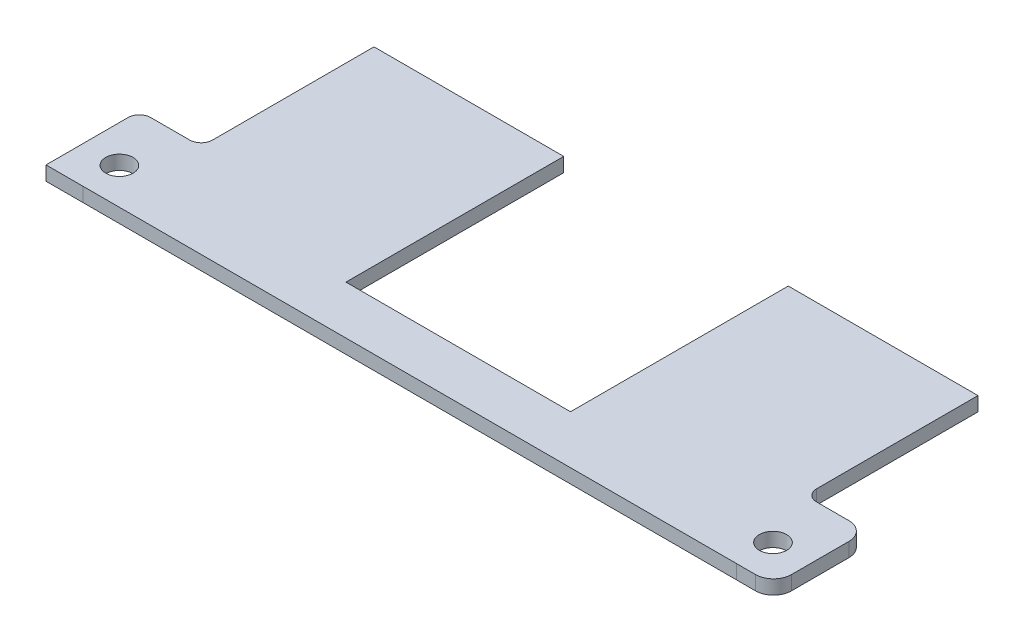
ISO-10303-21;
HEADER;
FILE_DESCRIPTION(('STEP AP214'),'2;1');
FILE_NAME('part.step','',(''),(''),'','','');
FILE_SCHEMA(('AUTOMOTIVE_DESIGN { 1 0 10303 214 1 1 1 1 }'));
ENDSEC;
DATA;
#1=APPLICATION_CONTEXT('core data for automotive mechanical design processes');
#2=APPLICATION_PROTOCOL_DEFINITION('international standard','automotive_design',2000,#1);
#3=PRODUCT_CONTEXT('',#1,'mechanical');
#4=PRODUCT('Part','Part','',(#3));
#5=PRODUCT_RELATED_PRODUCT_CATEGORY('part','',(#4));
#6=PRODUCT_DEFINITION_FORMATION('','',#4);
#7=PRODUCT_DEFINITION_CONTEXT('part definition',#1,'design');
#8=PRODUCT_DEFINITION('design','',#6,#7);
#9=PRODUCT_DEFINITION_SHAPE('','',#8);
#10=(LENGTH_UNIT() NAMED_UNIT(*) SI_UNIT(.MILLI.,.METRE.));
#11=(NAMED_UNIT(*) PLANE_ANGLE_UNIT() SI_UNIT($,.RADIAN.));
#12=(NAMED_UNIT(*) SI_UNIT($,.STERADIAN.) SOLID_ANGLE_UNIT());
#13=UNCERTAINTY_MEASURE_WITH_UNIT(LENGTH_MEASURE(1.E-05),#10,'distance_accuracy_value','');
#14=(GEOMETRIC_REPRESENTATION_CONTEXT(3) GLOBAL_UNCERTAINTY_ASSIGNED_CONTEXT((#13)) GLOBAL_UNIT_ASSIGNED_CONTEXT((#10,
#11,#12)) REPRESENTATION_CONTEXT('',''));
#15=CARTESIAN_POINT('',(0.,0.,0.));
#16=DIRECTION('',(0.,0.,1.));
#17=DIRECTION('',(1.,0.,0.));
#18=AXIS2_PLACEMENT_3D('',#15,#16,#17);
#19=CARTESIAN_POINT('',(38.8512933051951,1.575,38.0144122461493));
#20=DIRECTION('',(0.,1.,0.));
#21=DIRECTION('',(0.,0.,1.));
#22=AXIS2_PLACEMENT_3D('',#19,#20,#21);
#23=PLANE('',#22);
#24=CARTESIAN_POINT('',(36.7272933151951,1.575,35.947946891947));
#25=DIRECTION('',(0.,1.,0.));
#26=DIRECTION('',(0.,0.,1.));
#27=AXIS2_PLACEMENT_3D('',#24,#25,#26);
#28=CIRCLE('',#27,1.52399999234956);
#29=CARTESIAN_POINT('',(36.7272933151951,1.575,37.4719468842965));
#30=VERTEX_POINT('',#29);
#31=EDGE_CURVE('E211',#30,#30,#28,.T.);
#32=ORIENTED_EDGE('',*,*,#31,.F.);
#33=EDGE_LOOP('',(#32));
#34=FACE_BOUND('',#33,.T.);
#35=DIRECTION('',(1.,0.,0.));
#36=VECTOR('',#35,1.);
#37=CARTESIAN_POINT('',(-29.6747066928049,1.575,40.0124122461493));
#38=LINE('',#37,#36);
#39=CARTESIAN_POINT('',(-36.0247067008049,1.575,40.0124122461493));
#40=VERTEX_POINT('',#39);
#41=CARTESIAN_POINT('',(36.7272933151951,1.575,40.0124122461493));
#42=VERTEX_POINT('',#41);
#43=EDGE_CURVE('E50',#40,#42,#38,.T.);
#44=ORIENTED_EDGE('',*,*,#43,.T.);
#45=DIRECTION('',(0.,0.,1.));
#46=VECTOR('',#45,1.);
#47=CARTESIAN_POINT('',(36.7272933151951,1.575,40.0144122461493));
#48=LINE('',#47,#46);
#49=CARTESIAN_POINT('',(36.7272933151951,1.575,40.0144122461493));
#50=VERTEX_POINT('',#49);
#51=EDGE_CURVE('E364',#42,#50,#48,.T.);
#52=ORIENTED_EDGE('',*,*,#51,.T.);
#53=DIRECTION('',(1.,0.,0.));
#54=VECTOR('',#53,1.);
#55=CARTESIAN_POINT('',(38.8512933051951,1.575,40.0144122461493));
#56=LINE('',#55,#54);
#57=CARTESIAN_POINT('',(38.8512933051951,1.575,40.0144122461493));
#58=VERTEX_POINT('',#57);
#59=EDGE_CURVE('E304',#50,#58,#56,.T.);
#60=ORIENTED_EDGE('',*,*,#59,.T.);
#61=CARTESIAN_POINT('',(38.8512933051951,1.575,38.0144122461493));
#62=DIRECTION('',(0.,1.,0.));
#63=DIRECTION('',(0.,0.,1.));
#64=AXIS2_PLACEMENT_3D('',#61,#62,#63);
#65=CIRCLE('',#64,2.);
#66=CARTESIAN_POINT('',(40.8512933051951,1.575,38.0144122461492));
#67=VERTEX_POINT('',#66);
#68=EDGE_CURVE('E326',#58,#67,#65,.T.);
#69=ORIENTED_EDGE('',*,*,#68,.T.);
#70=DIRECTION('',(0.,0.,-1.));
#71=VECTOR('',#70,1.);
#72=CARTESIAN_POINT('',(40.8512933051951,1.575,38.0144122461492));
#73=LINE('',#72,#71);
#74=CARTESIAN_POINT('',(40.8512933051951,1.575,31.615946891947));
#75=VERTEX_POINT('',#74);
#76=EDGE_CURVE('E323',#67,#75,#73,.T.);
#77=ORIENTED_EDGE('',*,*,#76,.T.);
#78=CARTESIAN_POINT('',(38.8512933051951,1.575,31.615946891947));
#79=DIRECTION('',(0.,1.,0.));
#80=DIRECTION('',(0.,0.,1.));
#81=AXIS2_PLACEMENT_3D('',#78,#79,#80);
#82=CIRCLE('',#81,2.);
#83=CARTESIAN_POINT('',(38.8512933051951,1.575,29.615946891947));
#84=VERTEX_POINT('',#83);
#85=EDGE_CURVE('E325',#75,#84,#82,.T.);
#86=ORIENTED_EDGE('',*,*,#85,.T.);
#87=DIRECTION('',(-1.,0.,0.));
#88=VECTOR('',#87,1.);
#89=CARTESIAN_POINT('',(38.8512933051951,1.575,29.615946891947));
#90=LINE('',#89,#88);
#91=CARTESIAN_POINT('',(35.2462933051951,1.575,29.615946891947));
#92=VERTEX_POINT('',#91);
#93=EDGE_CURVE('E328',#84,#92,#90,.T.);
#94=ORIENTED_EDGE('',*,*,#93,.T.);
#95=CARTESIAN_POINT('',(35.2462933051951,1.575,28.345946891947));
#96=DIRECTION('',(0.,-1.,0.));
#97=DIRECTION('',(0.,0.,1.));
#98=AXIS2_PLACEMENT_3D('',#95,#96,#97);
#99=CIRCLE('',#98,1.26999999999999);
#100=CARTESIAN_POINT('',(33.9762933051951,1.575,28.345946891947));
#101=VERTEX_POINT('',#100);
#102=EDGE_CURVE('E334',#92,#101,#99,.T.);
#103=ORIENTED_EDGE('',*,*,#102,.T.);
#104=DIRECTION('',(0.,0.,-1.));
#105=VECTOR('',#104,1.);
#106=CARTESIAN_POINT('',(33.9762933051951,1.575,28.345946891947));
#107=LINE('',#106,#105);
#108=CARTESIAN_POINT('',(33.9762933051951,1.575,10.3704284449379));
#109=VERTEX_POINT('',#108);
#110=EDGE_CURVE('E336',#101,#109,#107,.T.);
#111=ORIENTED_EDGE('',*,*,#110,.T.);
#112=DIRECTION('',(-1.,0.,0.));
#113=VECTOR('',#112,1.);
#114=CARTESIAN_POINT('',(12.8512933091951,1.575,10.3704284449379));
#115=LINE('',#114,#113);
#116=CARTESIAN_POINT('',(12.8512933091951,1.575,10.3704284449379));
#117=VERTEX_POINT('',#116);
#118=EDGE_CURVE('E338',#109,#117,#115,.T.);
#119=ORIENTED_EDGE('',*,*,#118,.T.);
#120=DIRECTION('',(0.,0.,1.));
#121=VECTOR('',#120,1.);
#122=CARTESIAN_POINT('',(12.8512933091951,1.575,10.3704284449379));
#123=LINE('',#122,#121);
#124=CARTESIAN_POINT('',(12.8512933091951,1.575,34.615947015947));
#125=VERTEX_POINT('',#124);
#126=EDGE_CURVE('E340',#117,#125,#123,.T.);
#127=ORIENTED_EDGE('',*,*,#126,.T.);
#128=DIRECTION('',(-1.,0.,0.));
#129=VECTOR('',#128,1.);
#130=CARTESIAN_POINT('',(-12.1487066908049,1.575,34.615947015947));
#131=LINE('',#130,#129);
#132=CARTESIAN_POINT('',(-12.1487066908049,1.575,34.615947015947));
#133=VERTEX_POINT('',#132);
#134=EDGE_CURVE('E342',#125,#133,#131,.T.);
#135=ORIENTED_EDGE('',*,*,#134,.T.);
#136=DIRECTION('',(0.,0.,-1.));
#137=VECTOR('',#136,1.);
#138=CARTESIAN_POINT('',(-12.1487066908049,1.575,17.871301307947));
#139=LINE('',#138,#137);
#140=CARTESIAN_POINT('',(-12.1487066908049,1.575,10.3704284449379));
#141=VERTEX_POINT('',#140);
#142=EDGE_CURVE('E344',#133,#141,#139,.T.);
#143=ORIENTED_EDGE('',*,*,#142,.T.);
#144=DIRECTION('',(-1.,0.,0.));
#145=VECTOR('',#144,1.);
#146=CARTESIAN_POINT('',(-33.2737066908049,1.575,10.3704284449379));
#147=LINE('',#146,#145);
#148=CARTESIAN_POINT('',(-33.2737066908049,1.575,10.3704284449379));
#149=VERTEX_POINT('',#148);
#150=EDGE_CURVE('E346',#141,#149,#147,.T.);
#151=ORIENTED_EDGE('',*,*,#150,.T.);
#152=DIRECTION('',(0.,0.,1.));
#153=VECTOR('',#152,1.);
#154=CARTESIAN_POINT('',(-33.2737066908049,1.575,10.3704284449379));
#155=LINE('',#154,#153);
#156=CARTESIAN_POINT('',(-33.2737066908049,1.575,28.345946891947));
#157=VERTEX_POINT('',#156);
#158=EDGE_CURVE('E348',#149,#157,#155,.T.);
#159=ORIENTED_EDGE('',*,*,#158,.T.);
#160=CARTESIAN_POINT('',(-34.5437066908049,1.575,28.345946891947));
#161=DIRECTION('',(0.,-1.,0.));
#162=DIRECTION('',(0.,0.,1.));
#163=AXIS2_PLACEMENT_3D('',#160,#161,#162);
#164=CIRCLE('',#163,1.26999999999999);
#165=CARTESIAN_POINT('',(-34.5437066908049,1.575,29.6159468919469));
#166=VERTEX_POINT('',#165);
#167=EDGE_CURVE('E350',#157,#166,#164,.T.);
#168=ORIENTED_EDGE('',*,*,#167,.T.);
#169=DIRECTION('',(-1.,0.,0.));
#170=VECTOR('',#169,1.);
#171=CARTESIAN_POINT('',(-34.5437066908049,1.575,29.6159468919469));
#172=LINE('',#171,#170);
#173=CARTESIAN_POINT('',(-38.8787066908049,1.575,29.6159468919469));
#174=VERTEX_POINT('',#173);
#175=EDGE_CURVE('E352',#166,#174,#172,.T.);
#176=ORIENTED_EDGE('',*,*,#175,.T.);
#177=CARTESIAN_POINT('',(-38.8787066908049,1.575,30.8859468919469));
#178=DIRECTION('',(0.,1.,0.));
#179=DIRECTION('',(0.,0.,1.));
#180=AXIS2_PLACEMENT_3D('',#177,#178,#179);
#181=CIRCLE('',#180,1.26999999999999);
#182=CARTESIAN_POINT('',(-40.1487066908049,1.575,30.8859468919469));
#183=VERTEX_POINT('',#182);
#184=EDGE_CURVE('E188',#174,#183,#181,.T.);
#185=ORIENTED_EDGE('',*,*,#184,.T.);
#186=DIRECTION('',(0.,0.,1.));
#187=VECTOR('',#186,1.);
#188=CARTESIAN_POINT('',(-40.1487066908049,1.575,30.8859468919469));
#189=LINE('',#188,#187);
#190=CARTESIAN_POINT('',(-40.1487066908049,1.575,40.0144122461493));
#191=VERTEX_POINT('',#190);
#192=EDGE_CURVE('E182',#183,#191,#189,.T.);
#193=ORIENTED_EDGE('',*,*,#192,.T.);
#194=DIRECTION('',(1.,0.,0.));
#195=VECTOR('',#194,1.);
#196=CARTESIAN_POINT('',(-36.0247067008049,1.575,40.0144122461493));
#197=LINE('',#196,#195);
#198=CARTESIAN_POINT('',(-36.0247067008049,1.575,40.0144122461493));
#199=VERTEX_POINT('',#198);
#200=EDGE_CURVE('E186',#191,#199,#197,.T.);
#201=ORIENTED_EDGE('',*,*,#200,.T.);
#202=DIRECTION('',(-3.46944695195014E-12,0.,-1.));
#203=VECTOR('',#202,1.);
#204=CARTESIAN_POINT('',(-36.0247067008049,1.575,40.0144122461493));
#205=LINE('',#204,#203);
#206=EDGE_CURVE('E202',#199,#40,#205,.T.);
#207=ORIENTED_EDGE('',*,*,#206,.T.);
#208=EDGE_LOOP('',(#44,#52,#60,#69,#77,#86,#94,#103,#111,#119,#127,#135,#143,#151,#159,#168,
#176,#185,#193,#201,#207));
#209=FACE_BOUND('',#208,.T.);
#210=CARTESIAN_POINT('',(-36.0247067008049,1.575,35.965946891947));
#211=DIRECTION('',(0.,1.,0.));
#212=DIRECTION('',(0.,0.,1.));
#213=AXIS2_PLACEMENT_3D('',#210,#211,#212);
#214=CIRCLE('',#213,1.52400000765045);
#215=CARTESIAN_POINT('',(-36.0247067008049,1.575,37.4899468995974));
#216=VERTEX_POINT('',#215);
#217=EDGE_CURVE('E371',#216,#216,#214,.T.);
#218=ORIENTED_EDGE('',*,*,#217,.F.);
#219=EDGE_LOOP('',(#218));
#220=FACE_BOUND('',#219,.T.);
#221=ADVANCED_FACE('F33',(#34,#209,#220),#23,.T.);
#222=CARTESIAN_POINT('',(38.8512933051951,0.,38.0144122461493));
#223=DIRECTION('',(0.,1.,0.));
#224=DIRECTION('',(0.,0.,1.));
#225=AXIS2_PLACEMENT_3D('',#222,#223,#224);
#226=PLANE('',#225);
#227=CARTESIAN_POINT('',(36.7272933151951,0.,35.947946891947));
#228=DIRECTION('',(0.,1.,0.));
#229=DIRECTION('',(0.,0.,1.));
#230=AXIS2_PLACEMENT_3D('',#227,#228,#229);
#231=CIRCLE('',#230,1.52399999234956);
#232=CARTESIAN_POINT('',(36.7272933151951,0.,37.4719468842965));
#233=VERTEX_POINT('',#232);
#234=EDGE_CURVE('E368',#233,#233,#231,.T.);
#235=ORIENTED_EDGE('',*,*,#234,.T.);
#236=EDGE_LOOP('',(#235));
#237=FACE_BOUND('',#236,.T.);
#238=DIRECTION('',(0.,0.,1.));
#239=VECTOR('',#238,1.);
#240=CARTESIAN_POINT('',(36.7272933151951,0.,40.0144122461493));
#241=LINE('',#240,#239);
#242=CARTESIAN_POINT('',(36.7272933151951,0.,40.0124122461493));
#243=VERTEX_POINT('',#242);
#244=CARTESIAN_POINT('',(36.7272933151951,0.,40.0144122461493));
#245=VERTEX_POINT('',#244);
#246=EDGE_CURVE('E208',#243,#245,#241,.T.);
#247=ORIENTED_EDGE('',*,*,#246,.F.);
#248=DIRECTION('',(1.,0.,0.));
#249=VECTOR('',#248,1.);
#250=CARTESIAN_POINT('',(-36.0247067008049,0.,40.0124122461493));
#251=LINE('',#250,#249);
#252=CARTESIAN_POINT('',(-36.0247067008049,0.,40.0124122461493));
#253=VERTEX_POINT('',#252);
#254=EDGE_CURVE('E248',#253,#243,#251,.T.);
#255=ORIENTED_EDGE('',*,*,#254,.F.);
#256=DIRECTION('',(-3.46944695195014E-12,0.,-1.));
#257=VECTOR('',#256,1.);
#258=CARTESIAN_POINT('',(-36.0247067008049,0.,40.0144122461493));
#259=LINE('',#258,#257);
#260=CARTESIAN_POINT('',(-36.0247067008049,0.,40.0144122461493));
#261=VERTEX_POINT('',#260);
#262=EDGE_CURVE('E126',#261,#253,#259,.T.);
#263=ORIENTED_EDGE('',*,*,#262,.F.);
#264=DIRECTION('',(1.,0.,0.));
#265=VECTOR('',#264,1.);
#266=CARTESIAN_POINT('',(-36.0247067008049,0.,40.0144122461493));
#267=LINE('',#266,#265);
#268=CARTESIAN_POINT('',(-40.1487066908049,0.,40.0144122461493));
#269=VERTEX_POINT('',#268);
#270=EDGE_CURVE('E119',#269,#261,#267,.T.);
#271=ORIENTED_EDGE('',*,*,#270,.F.);
#272=DIRECTION('',(0.,0.,1.));
#273=VECTOR('',#272,1.);
#274=CARTESIAN_POINT('',(-40.1487066908049,0.,30.8859468919469));
#275=LINE('',#274,#273);
#276=CARTESIAN_POINT('',(-40.1487066908049,0.,30.8859468919469));
#277=VERTEX_POINT('',#276);
#278=EDGE_CURVE('E196',#277,#269,#275,.T.);
#279=ORIENTED_EDGE('',*,*,#278,.F.);
#280=CARTESIAN_POINT('',(-38.8787066908049,0.,30.8859468919469));
#281=DIRECTION('',(0.,1.,0.));
#282=DIRECTION('',(0.,0.,1.));
#283=AXIS2_PLACEMENT_3D('',#280,#281,#282);
#284=CIRCLE('',#283,1.26999999999999);
#285=CARTESIAN_POINT('',(-38.8787066908049,0.,29.6159468919469));
#286=VERTEX_POINT('',#285);
#287=EDGE_CURVE('E243',#286,#277,#284,.T.);
#288=ORIENTED_EDGE('',*,*,#287,.F.);
#289=DIRECTION('',(-1.,0.,0.));
#290=VECTOR('',#289,1.);
#291=CARTESIAN_POINT('',(-34.5437066908049,0.,29.6159468919469));
#292=LINE('',#291,#290);
#293=CARTESIAN_POINT('',(-34.5437066908049,0.,29.6159468919469));
#294=VERTEX_POINT('',#293);
#295=EDGE_CURVE('E241',#294,#286,#292,.T.);
#296=ORIENTED_EDGE('',*,*,#295,.F.);
#297=CARTESIAN_POINT('',(-34.5437066908049,0.,28.345946891947));
#298=DIRECTION('',(0.,-1.,0.));
#299=DIRECTION('',(0.,0.,1.));
#300=AXIS2_PLACEMENT_3D('',#297,#298,#299);
#301=CIRCLE('',#300,1.26999999999999);
#302=CARTESIAN_POINT('',(-33.2737066908049,0.,28.345946891947));
#303=VERTEX_POINT('',#302);
#304=EDGE_CURVE('E239',#303,#294,#301,.T.);
#305=ORIENTED_EDGE('',*,*,#304,.F.);
#306=DIRECTION('',(0.,0.,1.));
#307=VECTOR('',#306,1.);
#308=CARTESIAN_POINT('',(-33.2737066908049,0.,10.3704284449379));
#309=LINE('',#308,#307);
#310=CARTESIAN_POINT('',(-33.2737066908049,0.,10.3704284449379));
#311=VERTEX_POINT('',#310);
#312=EDGE_CURVE('E237',#311,#303,#309,.T.);
#313=ORIENTED_EDGE('',*,*,#312,.F.);
#314=DIRECTION('',(-1.,0.,0.));
#315=VECTOR('',#314,1.);
#316=CARTESIAN_POINT('',(-33.2737066908049,0.,10.3704284449379));
#317=LINE('',#316,#315);
#318=CARTESIAN_POINT('',(-12.1487066908049,0.,10.3704284449379));
#319=VERTEX_POINT('',#318);
#320=EDGE_CURVE('E235',#319,#311,#317,.T.);
#321=ORIENTED_EDGE('',*,*,#320,.F.);
#322=DIRECTION('',(0.,0.,-1.));
#323=VECTOR('',#322,1.);
#324=CARTESIAN_POINT('',(-12.1487066908049,0.,17.871301307947));
#325=LINE('',#324,#323);
#326=CARTESIAN_POINT('',(-12.1487066908049,0.,34.615947015947));
#327=VERTEX_POINT('',#326);
#328=EDGE_CURVE('E233',#327,#319,#325,.T.);
#329=ORIENTED_EDGE('',*,*,#328,.F.);
#330=DIRECTION('',(-1.,0.,0.));
#331=VECTOR('',#330,1.);
#332=CARTESIAN_POINT('',(-12.1487066908049,0.,34.615947015947));
#333=LINE('',#332,#331);
#334=CARTESIAN_POINT('',(12.8512933091951,0.,34.615947015947));
#335=VERTEX_POINT('',#334);
#336=EDGE_CURVE('E230',#335,#327,#333,.T.);
#337=ORIENTED_EDGE('',*,*,#336,.F.);
#338=DIRECTION('',(0.,0.,1.));
#339=VECTOR('',#338,1.);
#340=CARTESIAN_POINT('',(12.8512933091951,0.,17.871301307947));
#341=LINE('',#340,#339);
#342=CARTESIAN_POINT('',(12.8512933091951,0.,10.3704284449379));
#343=VERTEX_POINT('',#342);
#344=EDGE_CURVE('E228',#343,#335,#341,.T.);
#345=ORIENTED_EDGE('',*,*,#344,.F.);
#346=DIRECTION('',(-1.,0.,0.));
#347=VECTOR('',#346,1.);
#348=CARTESIAN_POINT('',(12.8512933091951,0.,10.3704284449379));
#349=LINE('',#348,#347);
#350=CARTESIAN_POINT('',(33.9762933051951,0.,10.3704284449379));
#351=VERTEX_POINT('',#350);
#352=EDGE_CURVE('E225',#351,#343,#349,.T.);
#353=ORIENTED_EDGE('',*,*,#352,.F.);
#354=DIRECTION('',(0.,0.,-1.));
#355=VECTOR('',#354,1.);
#356=CARTESIAN_POINT('',(33.9762933051951,0.,28.345946891947));
#357=LINE('',#356,#355);
#358=CARTESIAN_POINT('',(33.9762933051951,0.,28.345946891947));
#359=VERTEX_POINT('',#358);
#360=EDGE_CURVE('E223',#359,#351,#357,.T.);
#361=ORIENTED_EDGE('',*,*,#360,.F.);
#362=CARTESIAN_POINT('',(35.2462933051951,0.,28.345946891947));
#363=DIRECTION('',(0.,-1.,0.));
#364=DIRECTION('',(0.,0.,1.));
#365=AXIS2_PLACEMENT_3D('',#362,#363,#364);
#366=CIRCLE('',#365,1.26999999999999);
#367=CARTESIAN_POINT('',(35.2462933051951,0.,29.615946891947));
#368=VERTEX_POINT('',#367);
#369=EDGE_CURVE('E221',#368,#359,#366,.T.);
#370=ORIENTED_EDGE('',*,*,#369,.F.);
#371=DIRECTION('',(-1.,0.,0.));
#372=VECTOR('',#371,1.);
#373=CARTESIAN_POINT('',(38.8512933051951,0.,29.615946891947));
#374=LINE('',#373,#372);
#375=CARTESIAN_POINT('',(38.8512933051951,0.,29.615946891947));
#376=VERTEX_POINT('',#375);
#377=EDGE_CURVE('E219',#376,#368,#374,.T.);
#378=ORIENTED_EDGE('',*,*,#377,.F.);
#379=CARTESIAN_POINT('',(38.8512933051951,0.,31.615946891947));
#380=DIRECTION('',(0.,1.,0.));
#381=DIRECTION('',(0.,0.,1.));
#382=AXIS2_PLACEMENT_3D('',#379,#380,#381);
#383=CIRCLE('',#382,2.);
#384=CARTESIAN_POINT('',(40.8512933051951,0.,31.615946891947));
#385=VERTEX_POINT('',#384);
#386=EDGE_CURVE('E217',#385,#376,#383,.T.);
#387=ORIENTED_EDGE('',*,*,#386,.F.);
#388=DIRECTION('',(0.,0.,-1.));
#389=VECTOR('',#388,1.);
#390=CARTESIAN_POINT('',(40.8512933051951,0.,38.0144122461492));
#391=LINE('',#390,#389);
#392=CARTESIAN_POINT('',(40.8512933051951,0.,38.0144122461492));
#393=VERTEX_POINT('',#392);
#394=EDGE_CURVE('E215',#393,#385,#391,.T.);
#395=ORIENTED_EDGE('',*,*,#394,.F.);
#396=CARTESIAN_POINT('',(38.8512933051951,0.,38.0144122461493));
#397=DIRECTION('',(0.,1.,0.));
#398=DIRECTION('',(0.,0.,1.));
#399=AXIS2_PLACEMENT_3D('',#396,#397,#398);
#400=CIRCLE('',#399,2.);
#401=CARTESIAN_POINT('',(38.8512933051951,0.,40.0144122461493));
#402=VERTEX_POINT('',#401);
#403=EDGE_CURVE('E213',#402,#393,#400,.T.);
#404=ORIENTED_EDGE('',*,*,#403,.F.);
#405=DIRECTION('',(1.,0.,0.));
#406=VECTOR('',#405,1.);
#407=CARTESIAN_POINT('',(38.8512933051951,0.,40.0144122461493));
#408=LINE('',#407,#406);
#409=EDGE_CURVE('E210',#245,#402,#408,.T.);
#410=ORIENTED_EDGE('',*,*,#409,.F.);
#411=EDGE_LOOP('',(#247,#255,#263,#271,#279,#288,#296,#305,#313,#321,#329,#337,#345,#353,#361,
#370,#378,#387,#395,#404,#410));
#412=FACE_BOUND('',#411,.T.);
#413=CARTESIAN_POINT('',(-36.0247067008049,0.,35.965946891947));
#414=DIRECTION('',(0.,1.,0.));
#415=DIRECTION('',(0.,0.,1.));
#416=AXIS2_PLACEMENT_3D('',#413,#414,#415);
#417=CIRCLE('',#416,1.52400000765045);
#418=CARTESIAN_POINT('',(-36.0247067008049,0.,37.4899468995974));
#419=VERTEX_POINT('',#418);
#420=EDGE_CURVE('E374',#419,#419,#417,.T.);
#421=ORIENTED_EDGE('',*,*,#420,.T.);
#422=EDGE_LOOP('',(#421));
#423=FACE_BOUND('',#422,.T.);
#424=ADVANCED_FACE('F310',(#237,#412,#423),#226,.F.);
#425=CARTESIAN_POINT('',(36.7272933151951,1.575,40.0144122461493));
#426=DIRECTION('',(1.,0.,0.));
#427=DIRECTION('',(0.,0.,-1.));
#428=AXIS2_PLACEMENT_3D('',#425,#426,#427);
#429=PLANE('',#428);
#430=ORIENTED_EDGE('',*,*,#246,.T.);
#431=DIRECTION('',(0.,-1.,0.));
#432=VECTOR('',#431,1.);
#433=CARTESIAN_POINT('',(36.7272933151951,1.575,40.0144122461493));
#434=LINE('',#433,#432);
#435=EDGE_CURVE('E42',#50,#245,#434,.T.);
#436=ORIENTED_EDGE('',*,*,#435,.F.);
#437=ORIENTED_EDGE('',*,*,#51,.F.);
#438=DIRECTION('',(0.,-1.,0.));
#439=VECTOR('',#438,1.);
#440=CARTESIAN_POINT('',(36.7272933151951,1.575,40.0124122461493));
#441=LINE('',#440,#439);
#442=EDGE_CURVE('E11',#42,#243,#441,.T.);
#443=ORIENTED_EDGE('',*,*,#442,.T.);
#444=EDGE_LOOP('',(#430,#436,#437,#443));
#445=FACE_BOUND('',#444,.T.);
#446=ADVANCED_FACE('F35',(#445),#429,.F.);
#447=CARTESIAN_POINT('',(38.8512933051951,1.575,40.0144122461493));
#448=DIRECTION('',(0.,0.,-1.));
#449=DIRECTION('',(-1.,0.,0.));
#450=AXIS2_PLACEMENT_3D('',#447,#448,#449);
#451=PLANE('',#450);
#452=ORIENTED_EDGE('',*,*,#409,.T.);
#453=DIRECTION('',(0.,-1.,0.));
#454=VECTOR('',#453,1.);
#455=CARTESIAN_POINT('',(38.8512933051951,1.575,40.0144122461493));
#456=LINE('',#455,#454);
#457=EDGE_CURVE('E295',#58,#402,#456,.T.);
#458=ORIENTED_EDGE('',*,*,#457,.F.);
#459=ORIENTED_EDGE('',*,*,#59,.F.);
#460=ORIENTED_EDGE('',*,*,#435,.T.);
#461=EDGE_LOOP('',(#452,#458,#459,#460));
#462=FACE_BOUND('',#461,.T.);
#463=ADVANCED_FACE('F302',(#462),#451,.F.);
#464=CARTESIAN_POINT('',(38.8512933051951,1.575,38.0144122461493));
#465=DIRECTION('',(0.,-1.,0.));
#466=DIRECTION('',(0.,0.,-1.));
#467=AXIS2_PLACEMENT_3D('',#464,#465,#466);
#468=CYLINDRICAL_SURFACE('',#467,2.);
#469=ORIENTED_EDGE('',*,*,#403,.T.);
#470=DIRECTION('',(0.,-1.,0.));
#471=VECTOR('',#470,1.);
#472=CARTESIAN_POINT('',(40.8512933051951,1.575,38.0144122461492));
#473=LINE('',#472,#471);
#474=EDGE_CURVE('E292',#67,#393,#473,.T.);
#475=ORIENTED_EDGE('',*,*,#474,.F.);
#476=ORIENTED_EDGE('',*,*,#68,.F.);
#477=ORIENTED_EDGE('',*,*,#457,.T.);
#478=EDGE_LOOP('',(#469,#475,#476,#477));
#479=FACE_BOUND('',#478,.T.);
#480=ADVANCED_FACE('F317',(#479),#468,.T.);
#481=CARTESIAN_POINT('',(40.8512933051951,1.575,38.0144122461492));
#482=DIRECTION('',(-1.,0.,0.));
#483=DIRECTION('',(0.,0.,1.));
#484=AXIS2_PLACEMENT_3D('',#481,#482,#483);
#485=PLANE('',#484);
#486=ORIENTED_EDGE('',*,*,#394,.T.);
#487=DIRECTION('',(0.,-1.,0.));
#488=VECTOR('',#487,1.);
#489=CARTESIAN_POINT('',(40.8512933051951,1.575,31.615946891947));
#490=LINE('',#489,#488);
#491=EDGE_CURVE('E289',#75,#385,#490,.T.);
#492=ORIENTED_EDGE('',*,*,#491,.F.);
#493=ORIENTED_EDGE('',*,*,#76,.F.);
#494=ORIENTED_EDGE('',*,*,#474,.T.);
#495=EDGE_LOOP('',(#486,#492,#493,#494));
#496=FACE_BOUND('',#495,.T.);
#497=ADVANCED_FACE('F321',(#496),#485,.F.);
#498=CARTESIAN_POINT('',(38.8512933051951,1.575,31.615946891947));
#499=DIRECTION('',(0.,-1.,0.));
#500=DIRECTION('',(0.,0.,-1.));
#501=AXIS2_PLACEMENT_3D('',#498,#499,#500);
#502=CYLINDRICAL_SURFACE('',#501,2.);
#503=ORIENTED_EDGE('',*,*,#386,.T.);
#504=DIRECTION('',(0.,-1.,0.));
#505=VECTOR('',#504,1.);
#506=CARTESIAN_POINT('',(38.8512933051951,1.575,29.615946891947));
#507=LINE('',#506,#505);
#508=EDGE_CURVE('E286',#84,#376,#507,.T.);
#509=ORIENTED_EDGE('',*,*,#508,.F.);
#510=ORIENTED_EDGE('',*,*,#85,.F.);
#511=ORIENTED_EDGE('',*,*,#491,.T.);
#512=EDGE_LOOP('',(#503,#509,#510,#511));
#513=FACE_BOUND('',#512,.T.);
#514=ADVANCED_FACE('F447',(#513),#502,.T.);
#515=CARTESIAN_POINT('',(38.8512933051951,1.575,29.615946891947));
#516=DIRECTION('',(0.,0.,1.));
#517=DIRECTION('',(1.,0.,0.));
#518=AXIS2_PLACEMENT_3D('',#515,#516,#517);
#519=PLANE('',#518);
#520=ORIENTED_EDGE('',*,*,#377,.T.);
#521=DIRECTION('',(0.,-1.,0.));
#522=VECTOR('',#521,1.);
#523=CARTESIAN_POINT('',(35.2462933051951,1.575,29.615946891947));
#524=LINE('',#523,#522);
#525=EDGE_CURVE('E283',#92,#368,#524,.T.);
#526=ORIENTED_EDGE('',*,*,#525,.F.);
#527=ORIENTED_EDGE('',*,*,#93,.F.);
#528=ORIENTED_EDGE('',*,*,#508,.T.);
#529=EDGE_LOOP('',(#520,#526,#527,#528));
#530=FACE_BOUND('',#529,.T.);
#531=ADVANCED_FACE('F443',(#530),#519,.F.);
#532=CARTESIAN_POINT('',(35.2462933051951,1.575,28.345946891947));
#533=DIRECTION('',(0.,-1.,0.));
#534=DIRECTION('',(0.,0.,-1.));
#535=AXIS2_PLACEMENT_3D('',#532,#533,#534);
#536=CYLINDRICAL_SURFACE('',#535,1.26999999999999);
#537=ORIENTED_EDGE('',*,*,#369,.T.);
#538=DIRECTION('',(0.,-1.,0.));
#539=VECTOR('',#538,1.);
#540=CARTESIAN_POINT('',(33.9762933051951,1.575,28.345946891947));
#541=LINE('',#540,#539);
#542=EDGE_CURVE('E280',#101,#359,#541,.T.);
#543=ORIENTED_EDGE('',*,*,#542,.F.);
#544=ORIENTED_EDGE('',*,*,#102,.F.);
#545=ORIENTED_EDGE('',*,*,#525,.T.);
#546=EDGE_LOOP('',(#537,#543,#544,#545));
#547=FACE_BOUND('',#546,.T.);
#548=ADVANCED_FACE('F439',(#547),#536,.F.);
#549=CARTESIAN_POINT('',(33.9762933051951,1.575,28.345946891947));
#550=DIRECTION('',(-1.,0.,0.));
#551=DIRECTION('',(0.,0.,1.));
#552=AXIS2_PLACEMENT_3D('',#549,#550,#551);
#553=PLANE('',#552);
#554=ORIENTED_EDGE('',*,*,#360,.T.);
#555=DIRECTION('',(0.,-1.,0.));
#556=VECTOR('',#555,1.);
#557=CARTESIAN_POINT('',(33.9762933051951,1.575,10.3704284449379));
#558=LINE('',#557,#556);
#559=EDGE_CURVE('E277',#109,#351,#558,.T.);
#560=ORIENTED_EDGE('',*,*,#559,.F.);
#561=ORIENTED_EDGE('',*,*,#110,.F.);
#562=ORIENTED_EDGE('',*,*,#542,.T.);
#563=EDGE_LOOP('',(#554,#560,#561,#562));
#564=FACE_BOUND('',#563,.T.);
#565=ADVANCED_FACE('F435',(#564),#553,.F.);
#566=CARTESIAN_POINT('',(12.8512933091951,1.575,10.3704284449379));
#567=DIRECTION('',(0.,0.,1.));
#568=DIRECTION('',(1.,0.,0.));
#569=AXIS2_PLACEMENT_3D('',#566,#567,#568);
#570=PLANE('',#569);
#571=ORIENTED_EDGE('',*,*,#352,.T.);
#572=DIRECTION('',(0.,-1.,0.));
#573=VECTOR('',#572,1.);
#574=CARTESIAN_POINT('',(12.8512933091951,1.575,10.3704284449379));
#575=LINE('',#574,#573);
#576=EDGE_CURVE('E274',#117,#343,#575,.T.);
#577=ORIENTED_EDGE('',*,*,#576,.F.);
#578=ORIENTED_EDGE('',*,*,#118,.F.);
#579=ORIENTED_EDGE('',*,*,#559,.T.);
#580=EDGE_LOOP('',(#571,#577,#578,#579));
#581=FACE_BOUND('',#580,.T.);
#582=ADVANCED_FACE('F431',(#581),#570,.F.);
#583=CARTESIAN_POINT('',(12.8512933091951,1.575,17.871301307947));
#584=DIRECTION('',(1.,0.,0.));
#585=DIRECTION('',(0.,0.,-1.));
#586=AXIS2_PLACEMENT_3D('',#583,#584,#585);
#587=PLANE('',#586);
#588=ORIENTED_EDGE('',*,*,#344,.T.);
#589=DIRECTION('',(0.,-1.,0.));
#590=VECTOR('',#589,1.);
#591=CARTESIAN_POINT('',(12.8512933091951,1.575,34.615947015947));
#592=LINE('',#591,#590);
#593=EDGE_CURVE('E271',#125,#335,#592,.T.);
#594=ORIENTED_EDGE('',*,*,#593,.F.);
#595=ORIENTED_EDGE('',*,*,#126,.F.);
#596=ORIENTED_EDGE('',*,*,#576,.T.);
#597=EDGE_LOOP('',(#588,#594,#595,#596));
#598=FACE_BOUND('',#597,.T.);
#599=ADVANCED_FACE('F427',(#598),#587,.F.);
#600=CARTESIAN_POINT('',(-12.1487066908049,1.575,34.615947015947));
#601=DIRECTION('',(0.,0.,1.));
#602=DIRECTION('',(1.,0.,0.));
#603=AXIS2_PLACEMENT_3D('',#600,#601,#602);
#604=PLANE('',#603);
#605=ORIENTED_EDGE('',*,*,#336,.T.);
#606=DIRECTION('',(0.,-1.,0.));
#607=VECTOR('',#606,1.);
#608=CARTESIAN_POINT('',(-12.1487066908049,1.575,34.615947015947));
#609=LINE('',#608,#607);
#610=EDGE_CURVE('E268',#133,#327,#609,.T.);
#611=ORIENTED_EDGE('',*,*,#610,.F.);
#612=ORIENTED_EDGE('',*,*,#134,.F.);
#613=ORIENTED_EDGE('',*,*,#593,.T.);
#614=EDGE_LOOP('',(#605,#611,#612,#613));
#615=FACE_BOUND('',#614,.T.);
#616=ADVANCED_FACE('F423',(#615),#604,.F.);
#617=CARTESIAN_POINT('',(-12.1487066908049,1.575,17.871301307947));
#618=DIRECTION('',(-1.,0.,0.));
#619=DIRECTION('',(0.,0.,1.));
#620=AXIS2_PLACEMENT_3D('',#617,#618,#619);
#621=PLANE('',#620);
#622=ORIENTED_EDGE('',*,*,#328,.T.);
#623=DIRECTION('',(0.,-1.,0.));
#624=VECTOR('',#623,1.);
#625=CARTESIAN_POINT('',(-12.1487066908049,1.575,10.3704284449379));
#626=LINE('',#625,#624);
#627=EDGE_CURVE('E265',#141,#319,#626,.T.);
#628=ORIENTED_EDGE('',*,*,#627,.F.);
#629=ORIENTED_EDGE('',*,*,#142,.F.);
#630=ORIENTED_EDGE('',*,*,#610,.T.);
#631=EDGE_LOOP('',(#622,#628,#629,#630));
#632=FACE_BOUND('',#631,.T.);
#633=ADVANCED_FACE('F419',(#632),#621,.F.);
#634=CARTESIAN_POINT('',(-33.2737066908049,1.575,10.3704284449379));
#635=DIRECTION('',(0.,0.,1.));
#636=DIRECTION('',(1.,0.,0.));
#637=AXIS2_PLACEMENT_3D('',#634,#635,#636);
#638=PLANE('',#637);
#639=ORIENTED_EDGE('',*,*,#320,.T.);
#640=DIRECTION('',(0.,-1.,0.));
#641=VECTOR('',#640,1.);
#642=CARTESIAN_POINT('',(-33.2737066908049,1.575,10.3704284449379));
#643=LINE('',#642,#641);
#644=EDGE_CURVE('E262',#149,#311,#643,.T.);
#645=ORIENTED_EDGE('',*,*,#644,.F.);
#646=ORIENTED_EDGE('',*,*,#150,.F.);
#647=ORIENTED_EDGE('',*,*,#627,.T.);
#648=EDGE_LOOP('',(#639,#645,#646,#647));
#649=FACE_BOUND('',#648,.T.);
#650=ADVANCED_FACE('F415',(#649),#638,.F.);
#651=CARTESIAN_POINT('',(-33.2737066908049,1.575,10.3704284449379));
#652=DIRECTION('',(1.,0.,0.));
#653=DIRECTION('',(0.,0.,-1.));
#654=AXIS2_PLACEMENT_3D('',#651,#652,#653);
#655=PLANE('',#654);
#656=ORIENTED_EDGE('',*,*,#312,.T.);
#657=DIRECTION('',(0.,-1.,0.));
#658=VECTOR('',#657,1.);
#659=CARTESIAN_POINT('',(-33.2737066908049,1.575,28.345946891947));
#660=LINE('',#659,#658);
#661=EDGE_CURVE('E259',#157,#303,#660,.T.);
#662=ORIENTED_EDGE('',*,*,#661,.F.);
#663=ORIENTED_EDGE('',*,*,#158,.F.);
#664=ORIENTED_EDGE('',*,*,#644,.T.);
#665=EDGE_LOOP('',(#656,#662,#663,#664));
#666=FACE_BOUND('',#665,.T.);
#667=ADVANCED_FACE('F411',(#666),#655,.F.);
#668=CARTESIAN_POINT('',(-34.5437066908049,1.575,28.345946891947));
#669=DIRECTION('',(0.,-1.,0.));
#670=DIRECTION('',(0.,0.,-1.));
#671=AXIS2_PLACEMENT_3D('',#668,#669,#670);
#672=CYLINDRICAL_SURFACE('',#671,1.26999999999999);
#673=ORIENTED_EDGE('',*,*,#304,.T.);
#674=DIRECTION('',(0.,-1.,0.));
#675=VECTOR('',#674,1.);
#676=CARTESIAN_POINT('',(-34.5437066908049,1.575,29.6159468919469));
#677=LINE('',#676,#675);
#678=EDGE_CURVE('E256',#166,#294,#677,.T.);
#679=ORIENTED_EDGE('',*,*,#678,.F.);
#680=ORIENTED_EDGE('',*,*,#167,.F.);
#681=ORIENTED_EDGE('',*,*,#661,.T.);
#682=EDGE_LOOP('',(#673,#679,#680,#681));
#683=FACE_BOUND('',#682,.T.);
#684=ADVANCED_FACE('F408',(#683),#672,.F.);
#685=CARTESIAN_POINT('',(-34.5437066908049,1.575,29.6159468919469));
#686=DIRECTION('',(0.,0.,1.));
#687=DIRECTION('',(1.,0.,0.));
#688=AXIS2_PLACEMENT_3D('',#685,#686,#687);
#689=PLANE('',#688);
#690=ORIENTED_EDGE('',*,*,#295,.T.);
#691=DIRECTION('',(0.,-1.,0.));
#692=VECTOR('',#691,1.);
#693=CARTESIAN_POINT('',(-38.8787066908049,1.575,29.6159468919469));
#694=LINE('',#693,#692);
#695=EDGE_CURVE('E253',#174,#286,#694,.T.);
#696=ORIENTED_EDGE('',*,*,#695,.F.);
#697=ORIENTED_EDGE('',*,*,#175,.F.);
#698=ORIENTED_EDGE('',*,*,#678,.T.);
#699=EDGE_LOOP('',(#690,#696,#697,#698));
#700=FACE_BOUND('',#699,.T.);
#701=ADVANCED_FACE('F358',(#700),#689,.F.);
#702=CARTESIAN_POINT('',(-38.8787066908049,1.575,30.8859468919469));
#703=DIRECTION('',(0.,-1.,0.));
#704=DIRECTION('',(0.,0.,-1.));
#705=AXIS2_PLACEMENT_3D('',#702,#703,#704);
#706=CYLINDRICAL_SURFACE('',#705,1.26999999999999);
#707=ORIENTED_EDGE('',*,*,#287,.T.);
#708=DIRECTION('',(0.,-1.,0.));
#709=VECTOR('',#708,1.);
#710=CARTESIAN_POINT('',(-40.1487066908049,1.575,30.8859468919469));
#711=LINE('',#710,#709);
#712=EDGE_CURVE('E197',#183,#277,#711,.T.);
#713=ORIENTED_EDGE('',*,*,#712,.F.);
#714=ORIENTED_EDGE('',*,*,#184,.F.);
#715=ORIENTED_EDGE('',*,*,#695,.T.);
#716=EDGE_LOOP('',(#707,#713,#714,#715));
#717=FACE_BOUND('',#716,.T.);
#718=ADVANCED_FACE('F362',(#717),#706,.T.);
#719=CARTESIAN_POINT('',(-40.1487066908049,1.575,30.8859468919469));
#720=DIRECTION('',(1.,0.,0.));
#721=DIRECTION('',(0.,0.,-1.));
#722=AXIS2_PLACEMENT_3D('',#719,#720,#721);
#723=PLANE('',#722);
#724=ORIENTED_EDGE('',*,*,#278,.T.);
#725=DIRECTION('',(0.,-1.,0.));
#726=VECTOR('',#725,1.);
#727=CARTESIAN_POINT('',(-40.1487066908049,1.575,40.0144122461493));
#728=LINE('',#727,#726);
#729=EDGE_CURVE('E193',#191,#269,#728,.T.);
#730=ORIENTED_EDGE('',*,*,#729,.F.);
#731=ORIENTED_EDGE('',*,*,#192,.F.);
#732=ORIENTED_EDGE('',*,*,#712,.T.);
#733=EDGE_LOOP('',(#724,#730,#731,#732));
#734=FACE_BOUND('',#733,.T.);
#735=ADVANCED_FACE('F194',(#734),#723,.F.);
#736=CARTESIAN_POINT('',(-36.0247067008049,1.575,40.0144122461493));
#737=DIRECTION('',(0.,0.,-1.));
#738=DIRECTION('',(-1.,0.,0.));
#739=AXIS2_PLACEMENT_3D('',#736,#737,#738);
#740=PLANE('',#739);
#741=ORIENTED_EDGE('',*,*,#270,.T.);
#742=DIRECTION('',(0.,-1.,0.));
#743=VECTOR('',#742,1.);
#744=CARTESIAN_POINT('',(-36.0247067008049,1.575,40.0144122461493));
#745=LINE('',#744,#743);
#746=EDGE_CURVE('E198',#199,#261,#745,.T.);
#747=ORIENTED_EDGE('',*,*,#746,.F.);
#748=ORIENTED_EDGE('',*,*,#200,.F.);
#749=ORIENTED_EDGE('',*,*,#729,.T.);
#750=EDGE_LOOP('',(#741,#747,#748,#749));
#751=FACE_BOUND('',#750,.T.);
#752=ADVANCED_FACE('F200',(#751),#740,.F.);
#753=CARTESIAN_POINT('',(-36.0247067008049,1.575,40.0144122461493));
#754=DIRECTION('',(-1.,0.,3.46944695195014E-12));
#755=DIRECTION('',(3.46944695195014E-12,0.,1.));
#756=AXIS2_PLACEMENT_3D('',#753,#754,#755);
#757=PLANE('',#756);
#758=ORIENTED_EDGE('',*,*,#262,.T.);
#759=DIRECTION('',(0.,-1.,0.));
#760=VECTOR('',#759,1.);
#761=CARTESIAN_POINT('',(-36.0247067008049,1.575,40.0124122461493));
#762=LINE('',#761,#760);
#763=EDGE_CURVE('E204',#40,#253,#762,.T.);
#764=ORIENTED_EDGE('',*,*,#763,.F.);
#765=ORIENTED_EDGE('',*,*,#206,.F.);
#766=ORIENTED_EDGE('',*,*,#746,.T.);
#767=EDGE_LOOP('',(#758,#764,#765,#766));
#768=FACE_BOUND('',#767,.T.);
#769=ADVANCED_FACE('F397',(#768),#757,.F.);
#770=CARTESIAN_POINT('',(-36.0247067008049,1.575,40.0124122461493));
#771=DIRECTION('',(0.,0.,-1.));
#772=DIRECTION('',(-1.,0.,0.));
#773=AXIS2_PLACEMENT_3D('',#770,#771,#772);
#774=PLANE('',#773);
#775=ORIENTED_EDGE('',*,*,#254,.T.);
#776=ORIENTED_EDGE('',*,*,#442,.F.);
#777=ORIENTED_EDGE('',*,*,#43,.F.);
#778=ORIENTED_EDGE('',*,*,#763,.T.);
#779=EDGE_LOOP('',(#775,#776,#777,#778));
#780=FACE_BOUND('',#779,.T.);
#781=ADVANCED_FACE('F363',(#780),#774,.F.);
#782=CARTESIAN_POINT('',(36.7272933151951,1.575,35.947946891947));
#783=DIRECTION('',(0.,-1.,0.));
#784=DIRECTION('',(0.,0.,-1.));
#785=AXIS2_PLACEMENT_3D('',#782,#783,#784);
#786=CYLINDRICAL_SURFACE('',#785,1.52399999234956);
#787=ORIENTED_EDGE('',*,*,#31,.T.);
#788=EDGE_LOOP('',(#787));
#789=FACE_BOUND('',#788,.T.);
#790=ORIENTED_EDGE('',*,*,#234,.F.);
#791=EDGE_LOOP('',(#790));
#792=FACE_BOUND('',#791,.T.);
#793=ADVANCED_FACE('F392',(#789,#792),#786,.F.);
#794=CARTESIAN_POINT('',(-36.0247067008049,1.575,35.965946891947));
#795=DIRECTION('',(0.,-1.,0.));
#796=DIRECTION('',(0.,0.,-1.));
#797=AXIS2_PLACEMENT_3D('',#794,#795,#796);
#798=CYLINDRICAL_SURFACE('',#797,1.52400000765045);
#799=ORIENTED_EDGE('',*,*,#217,.T.);
#800=EDGE_LOOP('',(#799));
#801=FACE_BOUND('',#800,.T.);
#802=ORIENTED_EDGE('',*,*,#420,.F.);
#803=EDGE_LOOP('',(#802));
#804=FACE_BOUND('',#803,.T.);
#805=ADVANCED_FACE('F380',(#801,#804),#798,.F.);
#806=CLOSED_SHELL('',(#221,#424,#446,#463,#480,#497,#514,#531,#548,#565,#582,#599,#616,#633,
#650,#667,#684,#701,#718,#735,#752,#769,#781,#793,#805));
#807=MANIFOLD_SOLID_BREP('B2',#806);
#808=ADVANCED_BREP_SHAPE_REPRESENTATION('',(#18,#807),#14);
#809=SHAPE_DEFINITION_REPRESENTATION(#9,#808);
ENDSEC;
END-ISO-10303-21;
